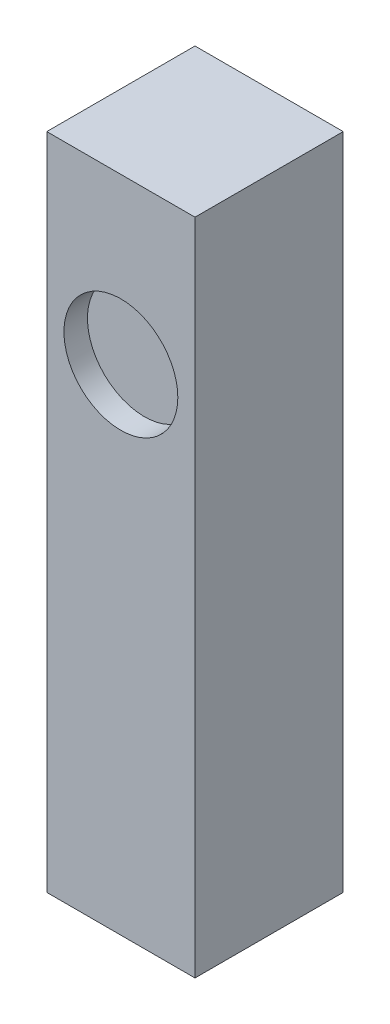
ISO-10303-21;
HEADER;
FILE_DESCRIPTION(('STEP AP214'),'2;1');
FILE_NAME('part.step','',(''),(''),'','','');
FILE_SCHEMA(('AUTOMOTIVE_DESIGN { 1 0 10303 214 1 1 1 1 }'));
ENDSEC;
DATA;
#1=APPLICATION_CONTEXT('core data for automotive mechanical design processes');
#2=APPLICATION_PROTOCOL_DEFINITION('international standard','automotive_design',2000,#1);
#3=PRODUCT_CONTEXT('',#1,'mechanical');
#4=PRODUCT('Part','Part','',(#3));
#5=PRODUCT_RELATED_PRODUCT_CATEGORY('part','',(#4));
#6=PRODUCT_DEFINITION_FORMATION('','',#4);
#7=PRODUCT_DEFINITION_CONTEXT('part definition',#1,'design');
#8=PRODUCT_DEFINITION('design','',#6,#7);
#9=PRODUCT_DEFINITION_SHAPE('','',#8);
#10=(LENGTH_UNIT() NAMED_UNIT(*) SI_UNIT(.MILLI.,.METRE.));
#11=(NAMED_UNIT(*) PLANE_ANGLE_UNIT() SI_UNIT($,.RADIAN.));
#12=(NAMED_UNIT(*) SI_UNIT($,.STERADIAN.) SOLID_ANGLE_UNIT());
#13=UNCERTAINTY_MEASURE_WITH_UNIT(LENGTH_MEASURE(1.E-05),#10,'distance_accuracy_value','');
#14=(GEOMETRIC_REPRESENTATION_CONTEXT(3) GLOBAL_UNCERTAINTY_ASSIGNED_CONTEXT((#13)) GLOBAL_UNIT_ASSIGNED_CONTEXT((#10,
#11,#12)) REPRESENTATION_CONTEXT('',''));
#15=CARTESIAN_POINT('',(0.,0.,0.));
#16=DIRECTION('',(0.,0.,1.));
#17=DIRECTION('',(1.,0.,0.));
#18=AXIS2_PLACEMENT_3D('',#15,#16,#17);
#19=CARTESIAN_POINT('',(-80.,711.2,0.));
#20=DIRECTION('',(1.,0.,0.));
#21=DIRECTION('',(0.,0.,-1.));
#22=AXIS2_PLACEMENT_3D('',#19,#20,#21);
#23=PLANE('',#22);
#24=DIRECTION('',(0.,0.,1.));
#25=VECTOR('',#24,1.);
#26=CARTESIAN_POINT('',(-80.,0.,0.));
#27=LINE('',#26,#25);
#28=CARTESIAN_POINT('',(-80.,0.,-80.));
#29=VERTEX_POINT('',#28);
#30=CARTESIAN_POINT('',(-80.,0.,80.));
#31=VERTEX_POINT('',#30);
#32=EDGE_CURVE('E82',#29,#31,#27,.T.);
#33=ORIENTED_EDGE('',*,*,#32,.T.);
#34=DIRECTION('',(0.,-1.,0.));
#35=VECTOR('',#34,1.);
#36=CARTESIAN_POINT('',(-80.,711.2,80.));
#37=LINE('',#36,#35);
#38=CARTESIAN_POINT('',(-80.,711.2,80.));
#39=VERTEX_POINT('',#38);
#40=EDGE_CURVE('E11',#39,#31,#37,.T.);
#41=ORIENTED_EDGE('',*,*,#40,.F.);
#42=DIRECTION('',(0.,0.,1.));
#43=VECTOR('',#42,1.);
#44=CARTESIAN_POINT('',(-80.,711.2,-80.));
#45=LINE('',#44,#43);
#46=CARTESIAN_POINT('',(-80.,711.2,-80.));
#47=VERTEX_POINT('',#46);
#48=EDGE_CURVE('E86',#47,#39,#45,.T.);
#49=ORIENTED_EDGE('',*,*,#48,.F.);
#50=DIRECTION('',(0.,-1.,0.));
#51=VECTOR('',#50,1.);
#52=CARTESIAN_POINT('',(-80.,711.2,-80.));
#53=LINE('',#52,#51);
#54=EDGE_CURVE('E110',#47,#29,#53,.T.);
#55=ORIENTED_EDGE('',*,*,#54,.T.);
#56=EDGE_LOOP('',(#33,#41,#49,#55));
#57=FACE_BOUND('',#56,.T.);
#58=ADVANCED_FACE('F45',(#57),#23,.F.);
#59=CARTESIAN_POINT('',(80.,711.2,80.));
#60=DIRECTION('',(0.,0.,1.));
#61=DIRECTION('',(1.,0.,0.));
#62=AXIS2_PLACEMENT_3D('',#59,#60,#61);
#63=PLANE('',#62);
#64=CARTESIAN_POINT('',(0.,533.4,80.));
#65=DIRECTION('',(0.,0.,1.));
#66=DIRECTION('',(1.,0.,0.));
#67=AXIS2_PLACEMENT_3D('',#64,#65,#66);
#68=CIRCLE('',#67,61.468);
#69=CARTESIAN_POINT('',(61.468,533.4,80.));
#70=VERTEX_POINT('',#69);
#71=EDGE_CURVE('E133',#70,#70,#68,.T.);
#72=ORIENTED_EDGE('',*,*,#71,.F.);
#73=EDGE_LOOP('',(#72));
#74=FACE_BOUND('',#73,.T.);
#75=DIRECTION('',(-1.,0.,0.));
#76=VECTOR('',#75,1.);
#77=CARTESIAN_POINT('',(80.,0.,80.));
#78=LINE('',#77,#76);
#79=CARTESIAN_POINT('',(80.,0.,80.));
#80=VERTEX_POINT('',#79);
#81=EDGE_CURVE('E101',#80,#31,#78,.T.);
#82=ORIENTED_EDGE('',*,*,#81,.F.);
#83=DIRECTION('',(0.,-1.,0.));
#84=VECTOR('',#83,1.);
#85=CARTESIAN_POINT('',(80.,711.2,80.));
#86=LINE('',#85,#84);
#87=CARTESIAN_POINT('',(80.,711.2,80.));
#88=VERTEX_POINT('',#87);
#89=EDGE_CURVE('E54',#88,#80,#86,.T.);
#90=ORIENTED_EDGE('',*,*,#89,.F.);
#91=DIRECTION('',(1.,0.,0.));
#92=VECTOR('',#91,1.);
#93=CARTESIAN_POINT('',(-80.,711.2,80.));
#94=LINE('',#93,#92);
#95=EDGE_CURVE('E89',#39,#88,#94,.T.);
#96=ORIENTED_EDGE('',*,*,#95,.F.);
#97=ORIENTED_EDGE('',*,*,#40,.T.);
#98=EDGE_LOOP('',(#82,#90,#96,#97));
#99=FACE_BOUND('',#98,.T.);
#100=ADVANCED_FACE('F100',(#74,#99),#63,.T.);
#101=CARTESIAN_POINT('',(80.,711.2,0.));
#102=DIRECTION('',(-1.,0.,0.));
#103=DIRECTION('',(0.,0.,1.));
#104=AXIS2_PLACEMENT_3D('',#101,#102,#103);
#105=PLANE('',#104);
#106=DIRECTION('',(0.,0.,-1.));
#107=VECTOR('',#106,1.);
#108=CARTESIAN_POINT('',(80.,0.,0.));
#109=LINE('',#108,#107);
#110=CARTESIAN_POINT('',(80.,0.,-80.));
#111=VERTEX_POINT('',#110);
#112=EDGE_CURVE('E119',#80,#111,#109,.T.);
#113=ORIENTED_EDGE('',*,*,#112,.T.);
#114=DIRECTION('',(0.,-1.,0.));
#115=VECTOR('',#114,1.);
#116=CARTESIAN_POINT('',(80.,711.2,-80.));
#117=LINE('',#116,#115);
#118=CARTESIAN_POINT('',(80.,711.2,-80.));
#119=VERTEX_POINT('',#118);
#120=EDGE_CURVE('E104',#119,#111,#117,.T.);
#121=ORIENTED_EDGE('',*,*,#120,.F.);
#122=DIRECTION('',(0.,0.,1.));
#123=VECTOR('',#122,1.);
#124=CARTESIAN_POINT('',(80.,711.2,0.));
#125=LINE('',#124,#123);
#126=EDGE_CURVE('E93',#119,#88,#125,.T.);
#127=ORIENTED_EDGE('',*,*,#126,.T.);
#128=ORIENTED_EDGE('',*,*,#89,.T.);
#129=EDGE_LOOP('',(#113,#121,#127,#128));
#130=FACE_BOUND('',#129,.T.);
#131=ADVANCED_FACE('F105',(#130),#105,.F.);
#132=CARTESIAN_POINT('',(0.,711.2,-80.));
#133=DIRECTION('',(0.,0.,1.));
#134=DIRECTION('',(1.,0.,0.));
#135=AXIS2_PLACEMENT_3D('',#132,#133,#134);
#136=PLANE('',#135);
#137=DIRECTION('',(-1.,0.,0.));
#138=VECTOR('',#137,1.);
#139=CARTESIAN_POINT('',(0.,0.,-80.));
#140=LINE('',#139,#138);
#141=EDGE_CURVE('E78',#111,#29,#140,.T.);
#142=ORIENTED_EDGE('',*,*,#141,.T.);
#143=ORIENTED_EDGE('',*,*,#54,.F.);
#144=DIRECTION('',(-1.,0.,0.));
#145=VECTOR('',#144,1.);
#146=CARTESIAN_POINT('',(80.,711.2,-80.));
#147=LINE('',#146,#145);
#148=EDGE_CURVE('E62',#119,#47,#147,.T.);
#149=ORIENTED_EDGE('',*,*,#148,.F.);
#150=ORIENTED_EDGE('',*,*,#120,.T.);
#151=EDGE_LOOP('',(#142,#143,#149,#150));
#152=FACE_BOUND('',#151,.T.);
#153=ADVANCED_FACE('F129',(#152),#136,.F.);
#154=CARTESIAN_POINT('',(0.,711.2,0.));
#155=DIRECTION('',(0.,1.,0.));
#156=DIRECTION('',(0.,0.,1.));
#157=AXIS2_PLACEMENT_3D('',#154,#155,#156);
#158=PLANE('',#157);
#159=ORIENTED_EDGE('',*,*,#48,.T.);
#160=ORIENTED_EDGE('',*,*,#95,.T.);
#161=ORIENTED_EDGE('',*,*,#126,.F.);
#162=ORIENTED_EDGE('',*,*,#148,.T.);
#163=EDGE_LOOP('',(#159,#160,#161,#162));
#164=FACE_BOUND('',#163,.T.);
#165=ADVANCED_FACE('F91',(#164),#158,.T.);
#166=CARTESIAN_POINT('',(0.,0.,0.));
#167=DIRECTION('',(0.,1.,0.));
#168=DIRECTION('',(0.,0.,1.));
#169=AXIS2_PLACEMENT_3D('',#166,#167,#168);
#170=PLANE('',#169);
#171=ORIENTED_EDGE('',*,*,#32,.F.);
#172=ORIENTED_EDGE('',*,*,#141,.F.);
#173=ORIENTED_EDGE('',*,*,#112,.F.);
#174=ORIENTED_EDGE('',*,*,#81,.T.);
#175=EDGE_LOOP('',(#171,#172,#173,#174));
#176=FACE_BOUND('',#175,.T.);
#177=ADVANCED_FACE('F146',(#176),#170,.F.);
#178=CARTESIAN_POINT('',(0.,533.4,54.6));
#179=DIRECTION('',(0.,0.,1.));
#180=DIRECTION('',(1.,0.,0.));
#181=AXIS2_PLACEMENT_3D('',#178,#179,#180);
#182=CYLINDRICAL_SURFACE('',#181,61.468);
#183=CARTESIAN_POINT('',(0.,533.4,54.6));
#184=DIRECTION('',(0.,0.,1.));
#185=DIRECTION('',(1.,0.,0.));
#186=AXIS2_PLACEMENT_3D('',#183,#184,#185);
#187=CIRCLE('',#186,61.468);
#188=CARTESIAN_POINT('',(61.468,533.4,54.6));
#189=VERTEX_POINT('',#188);
#190=EDGE_CURVE('E116',#189,#189,#187,.T.);
#191=CARTESIAN_POINT('',(61.468,533.4,54.6));
#192=CARTESIAN_POINT('',(61.468,533.4,54.8645833333333));
#193=CARTESIAN_POINT('',(61.468,533.4,55.1291666666667));
#194=CARTESIAN_POINT('',(61.468,533.4,55.6583333333333));
#195=CARTESIAN_POINT('',(61.468,533.4,55.9229166666667));
#196=CARTESIAN_POINT('',(61.468,533.4,56.4520833333333));
#197=CARTESIAN_POINT('',(61.468,533.4,56.7166666666667));
#198=CARTESIAN_POINT('',(61.468,533.4,57.2458333333333));
#199=CARTESIAN_POINT('',(61.468,533.4,57.5104166666667));
#200=CARTESIAN_POINT('',(61.468,533.4,58.0395833333333));
#201=CARTESIAN_POINT('',(61.468,533.4,58.3041666666667));
#202=CARTESIAN_POINT('',(61.468,533.4,58.8333333333333));
#203=CARTESIAN_POINT('',(61.468,533.4,59.0979166666667));
#204=CARTESIAN_POINT('',(61.468,533.4,59.6270833333333));
#205=CARTESIAN_POINT('',(61.468,533.4,59.8916666666667));
#206=CARTESIAN_POINT('',(61.468,533.4,60.4208333333333));
#207=CARTESIAN_POINT('',(61.468,533.4,60.6854166666667));
#208=CARTESIAN_POINT('',(61.468,533.4,61.2145833333333));
#209=CARTESIAN_POINT('',(61.468,533.4,61.4791666666667));
#210=CARTESIAN_POINT('',(61.468,533.4,62.0083333333333));
#211=CARTESIAN_POINT('',(61.468,533.4,62.2729166666667));
#212=CARTESIAN_POINT('',(61.468,533.4,62.8020833333333));
#213=CARTESIAN_POINT('',(61.468,533.4,63.0666666666667));
#214=CARTESIAN_POINT('',(61.468,533.4,63.5958333333333));
#215=CARTESIAN_POINT('',(61.468,533.4,63.8604166666667));
#216=CARTESIAN_POINT('',(61.468,533.4,64.3895833333333));
#217=CARTESIAN_POINT('',(61.468,533.4,64.6541666666667));
#218=CARTESIAN_POINT('',(61.468,533.4,65.1833333333333));
#219=CARTESIAN_POINT('',(61.468,533.4,65.4479166666667));
#220=CARTESIAN_POINT('',(61.468,533.4,65.9770833333333));
#221=CARTESIAN_POINT('',(61.468,533.4,66.2416666666667));
#222=CARTESIAN_POINT('',(61.468,533.4,66.7708333333333));
#223=CARTESIAN_POINT('',(61.468,533.4,67.0354166666667));
#224=CARTESIAN_POINT('',(61.468,533.4,67.5645833333333));
#225=CARTESIAN_POINT('',(61.468,533.4,67.8291666666667));
#226=CARTESIAN_POINT('',(61.468,533.4,68.3583333333333));
#227=CARTESIAN_POINT('',(61.468,533.4,68.6229166666667));
#228=CARTESIAN_POINT('',(61.468,533.4,69.1520833333333));
#229=CARTESIAN_POINT('',(61.468,533.4,69.4166666666667));
#230=CARTESIAN_POINT('',(61.468,533.4,69.9458333333333));
#231=CARTESIAN_POINT('',(61.468,533.4,70.2104166666667));
#232=CARTESIAN_POINT('',(61.468,533.4,70.7395833333333));
#233=CARTESIAN_POINT('',(61.468,533.4,71.0041666666667));
#234=CARTESIAN_POINT('',(61.468,533.4,71.5333333333333));
#235=CARTESIAN_POINT('',(61.468,533.4,71.7979166666667));
#236=CARTESIAN_POINT('',(61.468,533.4,72.3270833333333));
#237=CARTESIAN_POINT('',(61.468,533.4,72.5916666666667));
#238=CARTESIAN_POINT('',(61.468,533.4,73.1208333333333));
#239=CARTESIAN_POINT('',(61.468,533.4,73.3854166666667));
#240=CARTESIAN_POINT('',(61.468,533.4,73.9145833333333));
#241=CARTESIAN_POINT('',(61.468,533.4,74.1791666666667));
#242=CARTESIAN_POINT('',(61.468,533.4,74.7083333333333));
#243=CARTESIAN_POINT('',(61.468,533.4,74.9729166666667));
#244=CARTESIAN_POINT('',(61.468,533.4,75.5020833333333));
#245=CARTESIAN_POINT('',(61.468,533.4,75.7666666666667));
#246=CARTESIAN_POINT('',(61.468,533.4,76.2958333333333));
#247=CARTESIAN_POINT('',(61.468,533.4,76.5604166666667));
#248=CARTESIAN_POINT('',(61.468,533.4,77.0895833333333));
#249=CARTESIAN_POINT('',(61.468,533.4,77.3541666666667));
#250=CARTESIAN_POINT('',(61.468,533.4,77.8833333333333));
#251=CARTESIAN_POINT('',(61.468,533.4,78.1479166666667));
#252=CARTESIAN_POINT('',(61.468,533.4,78.6770833333333));
#253=CARTESIAN_POINT('',(61.468,533.4,78.9416666666667));
#254=CARTESIAN_POINT('',(61.468,533.4,79.4708333333333));
#255=CARTESIAN_POINT('',(61.468,533.4,79.7354166666667));
#256=CARTESIAN_POINT('',(61.468,533.4,80.));
#257=B_SPLINE_CURVE_WITH_KNOTS('',3,(#191,#192,#193,#194,#195,#196,#197,#198,#199,#200,#201,
#202,#203,#204,#205,#206,#207,#208,#209,#210,#211,#212,#213,#214,#215,#216,#217,#218,#219,#220,
#221,#222,#223,#224,#225,#226,#227,#228,#229,#230,#231,#232,#233,#234,#235,#236,#237,#238,#239,
#240,#241,#242,#243,#244,#245,#246,#247,#248,#249,#250,#251,#252,#253,#254,#255,#256),
.UNSPECIFIED.,.F.,.F.,(4,2,2,2,2,2,2,2,2,2,2,2,2,2,2,2,2,2,2,2,2,2,2,2,2,2,2,2,2,2,2,2,4),(0.,
0.793749999999996,1.5875,2.38124999999999,3.175,3.96875,4.7625,5.55625,6.34999999999999,7.14375,
7.9375,8.73125,9.52499999999999,10.31875,11.1125,11.90625,12.7,13.49375,14.2875,15.08125,15.875,
16.66875,17.4625,18.25625,19.05,19.84375,20.6375,21.43125,22.225,23.01875,23.8125,24.60625,
25.4),.UNSPECIFIED.);
#258=EDGE_CURVE('BSEAM143',#189,#70,#257,.T.);
#259=ORIENTED_EDGE('',*,*,#190,.F.);
#260=ORIENTED_EDGE('',*,*,#71,.T.);
#261=ORIENTED_EDGE('',*,*,#258,.T.);
#262=ORIENTED_EDGE('',*,*,#258,.F.);
#263=EDGE_LOOP('',(#259,#261,#260,#262));
#264=FACE_BOUND('',#263,.T.);
#265=ADVANCED_FACE('F143',(#264),#182,.F.);
#266=CARTESIAN_POINT('',(0.,533.4,54.6));
#267=DIRECTION('',(0.,0.,1.));
#268=DIRECTION('',(1.,0.,0.));
#269=AXIS2_PLACEMENT_3D('',#266,#267,#268);
#270=PLANE('',#269);
#271=ORIENTED_EDGE('',*,*,#190,.T.);
#272=EDGE_LOOP('',(#271));
#273=FACE_BOUND('',#272,.T.);
#274=ADVANCED_FACE('F141',(#273),#270,.T.);
#275=CLOSED_SHELL('',(#58,#100,#131,#153,#165,#177,#265,#274));
#276=MANIFOLD_SOLID_BREP('B2',#275);
#277=ADVANCED_BREP_SHAPE_REPRESENTATION('',(#18,#276),#14);
#278=SHAPE_DEFINITION_REPRESENTATION(#9,#277);
ENDSEC;
END-ISO-10303-21;
